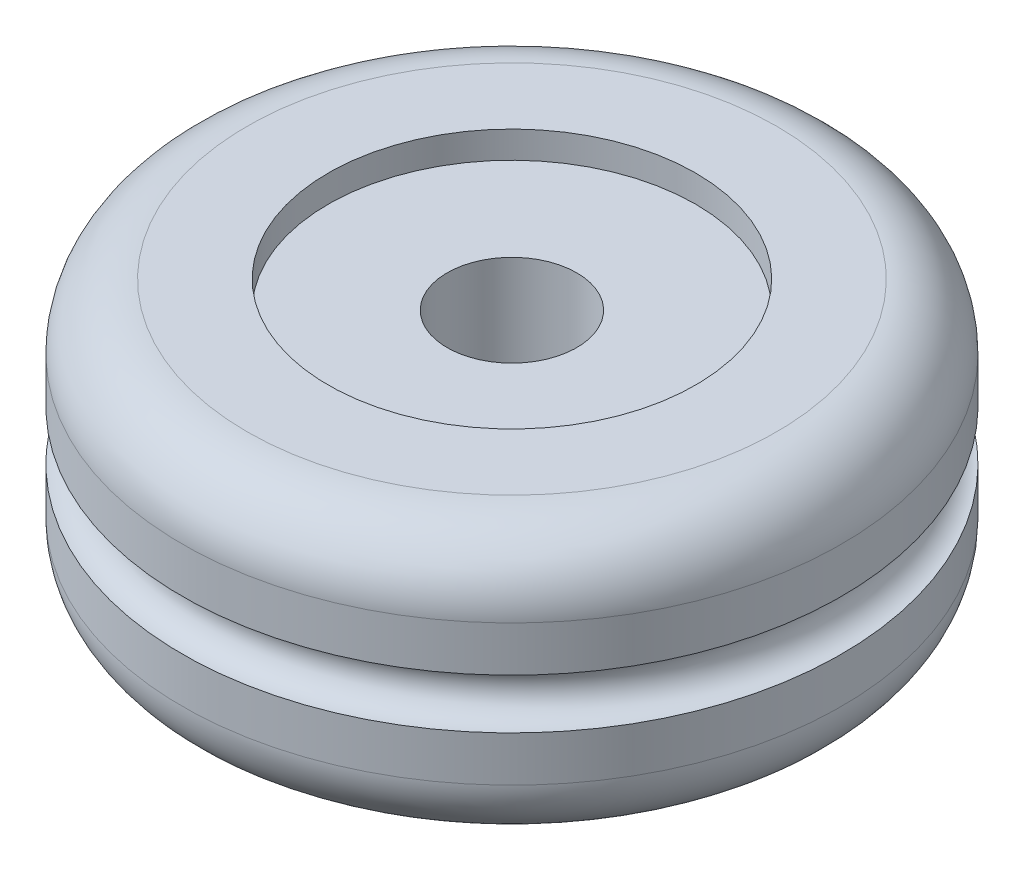
ISO-10303-21;
HEADER;
FILE_DESCRIPTION(('STEP AP214'),'2;1');
FILE_NAME('part.step','',(''),(''),'','','');
FILE_SCHEMA(('AUTOMOTIVE_DESIGN { 1 0 10303 214 1 1 1 1 }'));
ENDSEC;
DATA;
#1=APPLICATION_CONTEXT('core data for automotive mechanical design processes');
#2=APPLICATION_PROTOCOL_DEFINITION('international standard','automotive_design',2000,#1);
#3=PRODUCT_CONTEXT('',#1,'mechanical');
#4=PRODUCT('Part','Part','',(#3));
#5=PRODUCT_RELATED_PRODUCT_CATEGORY('part','',(#4));
#6=PRODUCT_DEFINITION_FORMATION('','',#4);
#7=PRODUCT_DEFINITION_CONTEXT('part definition',#1,'design');
#8=PRODUCT_DEFINITION('design','',#6,#7);
#9=PRODUCT_DEFINITION_SHAPE('','',#8);
#10=(LENGTH_UNIT() NAMED_UNIT(*) SI_UNIT(.MILLI.,.METRE.));
#11=(NAMED_UNIT(*) PLANE_ANGLE_UNIT() SI_UNIT($,.RADIAN.));
#12=(NAMED_UNIT(*) SI_UNIT($,.STERADIAN.) SOLID_ANGLE_UNIT());
#13=UNCERTAINTY_MEASURE_WITH_UNIT(LENGTH_MEASURE(1.E-05),#10,'distance_accuracy_value','');
#14=(GEOMETRIC_REPRESENTATION_CONTEXT(3) GLOBAL_UNCERTAINTY_ASSIGNED_CONTEXT((#13)) GLOBAL_UNIT_ASSIGNED_CONTEXT((#10,
#11,#12)) REPRESENTATION_CONTEXT('',''));
#15=CARTESIAN_POINT('',(0.,0.,0.));
#16=DIRECTION('',(0.,0.,1.));
#17=DIRECTION('',(1.,0.,0.));
#18=AXIS2_PLACEMENT_3D('',#15,#16,#17);
#19=CARTESIAN_POINT('',(0.,19.,0.));
#20=DIRECTION('',(0.,-1.,0.));
#21=DIRECTION('',(0.,0.,-1.));
#22=AXIS2_PLACEMENT_3D('',#19,#20,#21);
#23=TOROIDAL_SURFACE('',#22,24.5,6.);
#24=CARTESIAN_POINT('',(0.,25.,0.));
#25=DIRECTION('',(0.,-1.,0.));
#26=DIRECTION('',(0.,0.,-1.));
#27=AXIS2_PLACEMENT_3D('',#24,#25,#26);
#28=CIRCLE('',#27,24.5);
#29=CARTESIAN_POINT('',(0.,25.,-24.5));
#30=VERTEX_POINT('',#29);
#31=EDGE_CURVE('E75',#30,#30,#28,.T.);
#32=ORIENTED_EDGE('',*,*,#31,.T.);
#33=EDGE_LOOP('',(#32));
#34=FACE_BOUND('',#33,.T.);
#35=CARTESIAN_POINT('',(0.,19.,0.));
#36=DIRECTION('',(0.,-1.,0.));
#37=DIRECTION('',(0.,0.,-1.));
#38=AXIS2_PLACEMENT_3D('',#35,#36,#37);
#39=CIRCLE('',#38,30.5);
#40=CARTESIAN_POINT('',(0.,19.,-30.5));
#41=VERTEX_POINT('',#40);
#42=EDGE_CURVE('E10',#41,#41,#39,.T.);
#43=ORIENTED_EDGE('',*,*,#42,.F.);
#44=EDGE_LOOP('',(#43));
#45=FACE_BOUND('',#44,.T.);
#46=ADVANCED_FACE('F35',(#34,#45),#23,.T.);
#47=CARTESIAN_POINT('',(0.,26.1260401738639,0.));
#48=DIRECTION('',(0.,-1.,0.));
#49=DIRECTION('',(0.,0.,-1.));
#50=AXIS2_PLACEMENT_3D('',#47,#48,#49);
#51=CYLINDRICAL_SURFACE('',#50,30.5);
#52=ORIENTED_EDGE('',*,*,#42,.T.);
#53=EDGE_LOOP('',(#52));
#54=FACE_BOUND('',#53,.T.);
#55=CARTESIAN_POINT('',(0.,14.8131741647658,0.));
#56=DIRECTION('',(0.,-1.,0.));
#57=DIRECTION('',(0.,0.,-1.));
#58=AXIS2_PLACEMENT_3D('',#55,#56,#57);
#59=CIRCLE('',#58,30.5);
#60=CARTESIAN_POINT('',(0.,14.8131741647658,-30.5));
#61=VERTEX_POINT('',#60);
#62=EDGE_CURVE('E41',#61,#61,#59,.T.);
#63=ORIENTED_EDGE('',*,*,#62,.F.);
#64=EDGE_LOOP('',(#63));
#65=FACE_BOUND('',#64,.T.);
#66=ADVANCED_FACE('F93',(#54,#65),#51,.T.);
#67=CARTESIAN_POINT('',(0.,12.5,0.));
#68=DIRECTION('',(0.,-1.,0.));
#69=DIRECTION('',(0.,0.,-1.));
#70=AXIS2_PLACEMENT_3D('',#67,#68,#69);
#71=TOROIDAL_SURFACE('',#70,30.5,2.31317416476583);
#72=ORIENTED_EDGE('',*,*,#62,.T.);
#73=EDGE_LOOP('',(#72));
#74=FACE_BOUND('',#73,.T.);
#75=CARTESIAN_POINT('',(0.,10.1868258352342,0.));
#76=DIRECTION('',(0.,-1.,0.));
#77=DIRECTION('',(0.,0.,-1.));
#78=AXIS2_PLACEMENT_3D('',#75,#76,#77);
#79=CIRCLE('',#78,30.5);
#80=CARTESIAN_POINT('',(0.,10.1868258352342,-30.5));
#81=VERTEX_POINT('',#80);
#82=EDGE_CURVE('E45',#81,#81,#79,.T.);
#83=ORIENTED_EDGE('',*,*,#82,.F.);
#84=EDGE_LOOP('',(#83));
#85=FACE_BOUND('',#84,.T.);
#86=ADVANCED_FACE('F97',(#74,#85),#71,.F.);
#87=CARTESIAN_POINT('',(0.,26.1260401738639,0.));
#88=DIRECTION('',(0.,-1.,0.));
#89=DIRECTION('',(0.,0.,-1.));
#90=AXIS2_PLACEMENT_3D('',#87,#88,#89);
#91=CYLINDRICAL_SURFACE('',#90,30.5);
#92=ORIENTED_EDGE('',*,*,#82,.T.);
#93=EDGE_LOOP('',(#92));
#94=FACE_BOUND('',#93,.T.);
#95=CARTESIAN_POINT('',(0.,6.00000000000001,0.));
#96=DIRECTION('',(0.,-1.,0.));
#97=DIRECTION('',(0.,0.,-1.));
#98=AXIS2_PLACEMENT_3D('',#95,#96,#97);
#99=CIRCLE('',#98,30.5);
#100=CARTESIAN_POINT('',(0.,6.00000000000001,-30.5));
#101=VERTEX_POINT('',#100);
#102=EDGE_CURVE('E49',#101,#101,#99,.T.);
#103=ORIENTED_EDGE('',*,*,#102,.F.);
#104=EDGE_LOOP('',(#103));
#105=FACE_BOUND('',#104,.T.);
#106=ADVANCED_FACE('F101',(#94,#105),#91,.T.);
#107=CARTESIAN_POINT('',(0.,6.,0.));
#108=DIRECTION('',(0.,-1.,0.));
#109=DIRECTION('',(0.,0.,-1.));
#110=AXIS2_PLACEMENT_3D('',#107,#108,#109);
#111=TOROIDAL_SURFACE('',#110,24.5,6.);
#112=ORIENTED_EDGE('',*,*,#102,.T.);
#113=EDGE_LOOP('',(#112));
#114=FACE_BOUND('',#113,.T.);
#115=CARTESIAN_POINT('',(0.,0.,0.));
#116=DIRECTION('',(0.,-1.,0.));
#117=DIRECTION('',(0.,0.,-1.));
#118=AXIS2_PLACEMENT_3D('',#115,#116,#117);
#119=CIRCLE('',#118,24.5);
#120=CARTESIAN_POINT('',(0.,0.,-24.5));
#121=VERTEX_POINT('',#120);
#122=EDGE_CURVE('E54',#121,#121,#119,.T.);
#123=ORIENTED_EDGE('',*,*,#122,.F.);
#124=EDGE_LOOP('',(#123));
#125=FACE_BOUND('',#124,.T.);
#126=ADVANCED_FACE('F107',(#114,#125),#111,.T.);
#127=CARTESIAN_POINT('',(17.,0.,0.));
#128=DIRECTION('',(0.,-1.,0.));
#129=DIRECTION('',(0.,0.,-1.));
#130=AXIS2_PLACEMENT_3D('',#127,#128,#129);
#131=PLANE('',#130);
#132=ORIENTED_EDGE('',*,*,#122,.T.);
#133=EDGE_LOOP('',(#132));
#134=FACE_BOUND('',#133,.T.);
#135=CARTESIAN_POINT('',(0.,0.,0.));
#136=DIRECTION('',(0.,-1.,0.));
#137=DIRECTION('',(0.,0.,-1.));
#138=AXIS2_PLACEMENT_3D('',#135,#136,#137);
#139=CIRCLE('',#138,17.);
#140=CARTESIAN_POINT('',(0.,0.,-17.));
#141=VERTEX_POINT('',#140);
#142=EDGE_CURVE('E57',#141,#141,#139,.T.);
#143=ORIENTED_EDGE('',*,*,#142,.F.);
#144=EDGE_LOOP('',(#143));
#145=FACE_BOUND('',#144,.T.);
#146=ADVANCED_FACE('F111',(#134,#145),#131,.T.);
#147=CARTESIAN_POINT('',(0.,26.1260401738639,0.));
#148=DIRECTION('',(0.,-1.,0.));
#149=DIRECTION('',(0.,0.,-1.));
#150=AXIS2_PLACEMENT_3D('',#147,#148,#149);
#151=CYLINDRICAL_SURFACE('',#150,17.);
#152=ORIENTED_EDGE('',*,*,#142,.T.);
#153=EDGE_LOOP('',(#152));
#154=FACE_BOUND('',#153,.T.);
#155=CARTESIAN_POINT('',(0.,2.5,0.));
#156=DIRECTION('',(0.,-1.,0.));
#157=DIRECTION('',(0.,0.,-1.));
#158=AXIS2_PLACEMENT_3D('',#155,#156,#157);
#159=CIRCLE('',#158,17.);
#160=CARTESIAN_POINT('',(0.,2.5,-17.));
#161=VERTEX_POINT('',#160);
#162=EDGE_CURVE('E60',#161,#161,#159,.T.);
#163=ORIENTED_EDGE('',*,*,#162,.F.);
#164=EDGE_LOOP('',(#163));
#165=FACE_BOUND('',#164,.T.);
#166=ADVANCED_FACE('F115',(#154,#165),#151,.F.);
#167=CARTESIAN_POINT('',(6.,2.5,0.));
#168=DIRECTION('',(0.,-1.,0.));
#169=DIRECTION('',(0.,0.,-1.));
#170=AXIS2_PLACEMENT_3D('',#167,#168,#169);
#171=PLANE('',#170);
#172=ORIENTED_EDGE('',*,*,#162,.T.);
#173=EDGE_LOOP('',(#172));
#174=FACE_BOUND('',#173,.T.);
#175=CARTESIAN_POINT('',(0.,2.5,0.));
#176=DIRECTION('',(0.,-1.,0.));
#177=DIRECTION('',(0.,0.,-1.));
#178=AXIS2_PLACEMENT_3D('',#175,#176,#177);
#179=CIRCLE('',#178,6.);
#180=CARTESIAN_POINT('',(0.,2.5,-6.));
#181=VERTEX_POINT('',#180);
#182=EDGE_CURVE('E63',#181,#181,#179,.T.);
#183=ORIENTED_EDGE('',*,*,#182,.F.);
#184=EDGE_LOOP('',(#183));
#185=FACE_BOUND('',#184,.T.);
#186=ADVANCED_FACE('F119',(#174,#185),#171,.T.);
#187=CARTESIAN_POINT('',(0.,26.1260401738639,0.));
#188=DIRECTION('',(0.,-1.,0.));
#189=DIRECTION('',(0.,0.,-1.));
#190=AXIS2_PLACEMENT_3D('',#187,#188,#189);
#191=CYLINDRICAL_SURFACE('',#190,6.);
#192=ORIENTED_EDGE('',*,*,#182,.T.);
#193=EDGE_LOOP('',(#192));
#194=FACE_BOUND('',#193,.T.);
#195=CARTESIAN_POINT('',(0.,22.5,0.));
#196=DIRECTION('',(0.,-1.,0.));
#197=DIRECTION('',(0.,0.,-1.));
#198=AXIS2_PLACEMENT_3D('',#195,#196,#197);
#199=CIRCLE('',#198,6.);
#200=CARTESIAN_POINT('',(0.,22.5,-6.));
#201=VERTEX_POINT('',#200);
#202=EDGE_CURVE('E66',#201,#201,#199,.T.);
#203=ORIENTED_EDGE('',*,*,#202,.F.);
#204=EDGE_LOOP('',(#203));
#205=FACE_BOUND('',#204,.T.);
#206=ADVANCED_FACE('F123',(#194,#205),#191,.F.);
#207=CARTESIAN_POINT('',(6.,22.5,0.));
#208=DIRECTION('',(0.,1.,0.));
#209=DIRECTION('',(0.,0.,1.));
#210=AXIS2_PLACEMENT_3D('',#207,#208,#209);
#211=PLANE('',#210);
#212=ORIENTED_EDGE('',*,*,#202,.T.);
#213=EDGE_LOOP('',(#212));
#214=FACE_BOUND('',#213,.T.);
#215=CARTESIAN_POINT('',(0.,22.5,0.));
#216=DIRECTION('',(0.,-1.,0.));
#217=DIRECTION('',(0.,0.,-1.));
#218=AXIS2_PLACEMENT_3D('',#215,#216,#217);
#219=CIRCLE('',#218,17.);
#220=CARTESIAN_POINT('',(0.,22.5,-17.));
#221=VERTEX_POINT('',#220);
#222=EDGE_CURVE('E69',#221,#221,#219,.T.);
#223=ORIENTED_EDGE('',*,*,#222,.F.);
#224=EDGE_LOOP('',(#223));
#225=FACE_BOUND('',#224,.T.);
#226=ADVANCED_FACE('F89',(#214,#225),#211,.T.);
#227=CARTESIAN_POINT('',(0.,26.1260401738639,0.));
#228=DIRECTION('',(0.,-1.,0.));
#229=DIRECTION('',(0.,0.,-1.));
#230=AXIS2_PLACEMENT_3D('',#227,#228,#229);
#231=CYLINDRICAL_SURFACE('',#230,17.);
#232=ORIENTED_EDGE('',*,*,#222,.T.);
#233=EDGE_LOOP('',(#232));
#234=FACE_BOUND('',#233,.T.);
#235=CARTESIAN_POINT('',(0.,25.,0.));
#236=DIRECTION('',(0.,-1.,0.));
#237=DIRECTION('',(0.,0.,-1.));
#238=AXIS2_PLACEMENT_3D('',#235,#236,#237);
#239=CIRCLE('',#238,17.);
#240=CARTESIAN_POINT('',(0.,25.,-17.));
#241=VERTEX_POINT('',#240);
#242=EDGE_CURVE('E72',#241,#241,#239,.T.);
#243=ORIENTED_EDGE('',*,*,#242,.F.);
#244=EDGE_LOOP('',(#243));
#245=FACE_BOUND('',#244,.T.);
#246=ADVANCED_FACE('F83',(#234,#245),#231,.F.);
#247=CARTESIAN_POINT('',(17.,25.,0.));
#248=DIRECTION('',(0.,1.,0.));
#249=DIRECTION('',(0.,0.,1.));
#250=AXIS2_PLACEMENT_3D('',#247,#248,#249);
#251=PLANE('',#250);
#252=ORIENTED_EDGE('',*,*,#242,.T.);
#253=EDGE_LOOP('',(#252));
#254=FACE_BOUND('',#253,.T.);
#255=ORIENTED_EDGE('',*,*,#31,.F.);
#256=EDGE_LOOP('',(#255));
#257=FACE_BOUND('',#256,.T.);
#258=ADVANCED_FACE('F81',(#254,#257),#251,.T.);
#259=CLOSED_SHELL('',(#46,#66,#86,#106,#126,#146,#166,#186,#206,#226,#246,#258));
#260=MANIFOLD_SOLID_BREP('B2',#259);
#261=ADVANCED_BREP_SHAPE_REPRESENTATION('',(#18,#260),#14);
#262=SHAPE_DEFINITION_REPRESENTATION(#9,#261);
ENDSEC;
END-ISO-10303-21;
